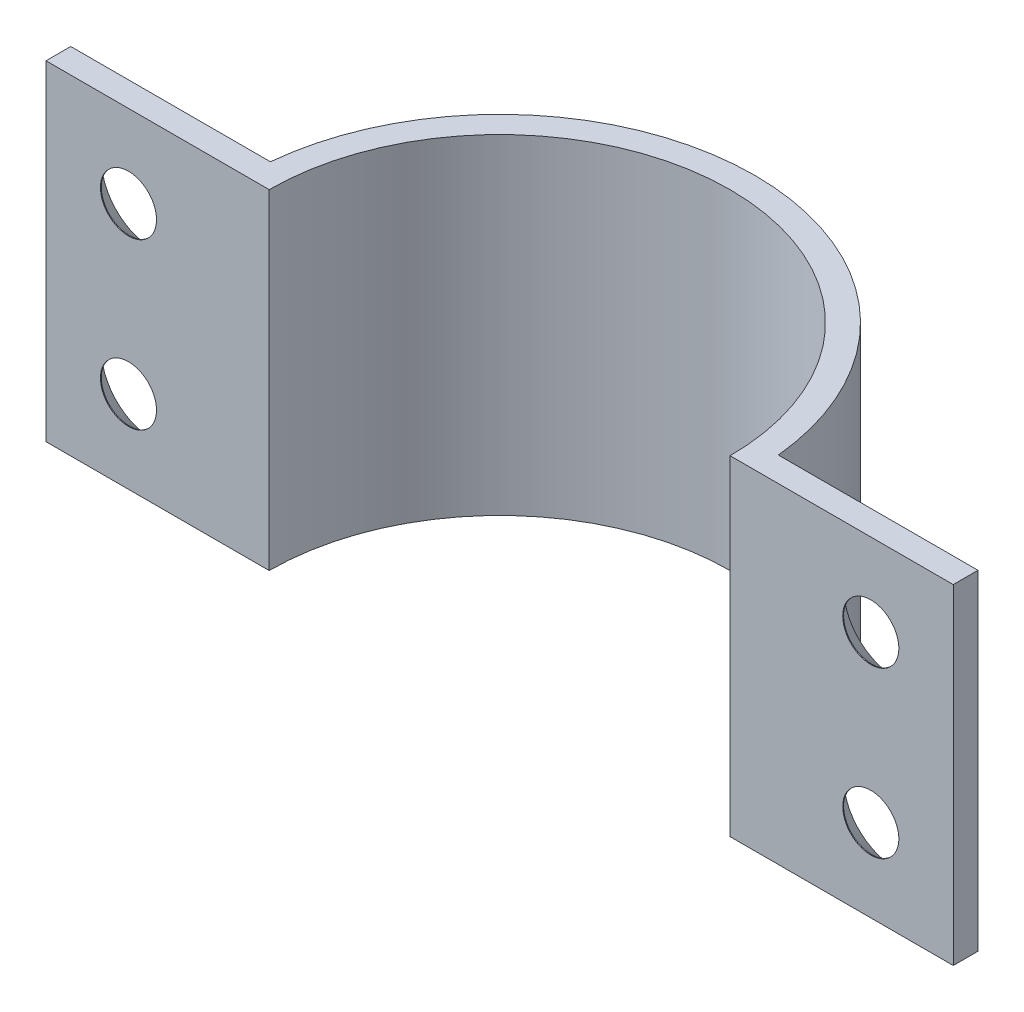
ISO-10303-21;
HEADER;
FILE_DESCRIPTION(('STEP AP214'),'2;1');
FILE_NAME('part.step','',(''),(''),'','','');
FILE_SCHEMA(('AUTOMOTIVE_DESIGN { 1 0 10303 214 1 1 1 1 }'));
ENDSEC;
DATA;
#1=APPLICATION_CONTEXT('core data for automotive mechanical design processes');
#2=APPLICATION_PROTOCOL_DEFINITION('international standard','automotive_design',2000,#1);
#3=PRODUCT_CONTEXT('',#1,'mechanical');
#4=PRODUCT('Part','Part','',(#3));
#5=PRODUCT_RELATED_PRODUCT_CATEGORY('part','',(#4));
#6=PRODUCT_DEFINITION_FORMATION('','',#4);
#7=PRODUCT_DEFINITION_CONTEXT('part definition',#1,'design');
#8=PRODUCT_DEFINITION('design','',#6,#7);
#9=PRODUCT_DEFINITION_SHAPE('','',#8);
#10=(LENGTH_UNIT() NAMED_UNIT(*) SI_UNIT(.MILLI.,.METRE.));
#11=(NAMED_UNIT(*) PLANE_ANGLE_UNIT() SI_UNIT($,.RADIAN.));
#12=(NAMED_UNIT(*) SI_UNIT($,.STERADIAN.) SOLID_ANGLE_UNIT());
#13=UNCERTAINTY_MEASURE_WITH_UNIT(LENGTH_MEASURE(1.E-05),#10,'distance_accuracy_value','');
#14=(GEOMETRIC_REPRESENTATION_CONTEXT(3) GLOBAL_UNCERTAINTY_ASSIGNED_CONTEXT((#13)) GLOBAL_UNIT_ASSIGNED_CONTEXT((#10,
#11,#12)) REPRESENTATION_CONTEXT('',''));
#15=CARTESIAN_POINT('',(0.,0.,0.));
#16=DIRECTION('',(0.,0.,1.));
#17=DIRECTION('',(1.,0.,0.));
#18=AXIS2_PLACEMENT_3D('',#15,#16,#17);
#19=CARTESIAN_POINT('',(0.,20.,0.));
#20=DIRECTION('',(0.,-1.,0.));
#21=DIRECTION('',(0.,0.,-1.));
#22=AXIS2_PLACEMENT_3D('',#19,#20,#21);
#23=CYLINDRICAL_SURFACE('',#22,15.47);
#24=CARTESIAN_POINT('',(0.,0.,0.));
#25=DIRECTION('',(0.,1.,0.));
#26=DIRECTION('',(0.,0.,1.));
#27=AXIS2_PLACEMENT_3D('',#24,#25,#26);
#28=CIRCLE('',#27,15.47);
#29=CARTESIAN_POINT('',(15.3971068710976,0.,-1.5));
#30=VERTEX_POINT('',#29);
#31=CARTESIAN_POINT('',(-15.3971068710976,0.,-1.5));
#32=VERTEX_POINT('',#31);
#33=EDGE_CURVE('E141',#30,#32,#28,.T.);
#34=ORIENTED_EDGE('',*,*,#33,.T.);
#35=DIRECTION('',(0.,-1.,0.));
#36=VECTOR('',#35,1.);
#37=CARTESIAN_POINT('',(-15.3971068710976,20.,-1.5));
#38=LINE('',#37,#36);
#39=CARTESIAN_POINT('',(-15.3971068710976,20.,-1.5));
#40=VERTEX_POINT('',#39);
#41=EDGE_CURVE('E11',#40,#32,#38,.T.);
#42=ORIENTED_EDGE('',*,*,#41,.F.);
#43=CARTESIAN_POINT('',(0.,20.,0.));
#44=DIRECTION('',(0.,1.,0.));
#45=DIRECTION('',(0.,0.,1.));
#46=AXIS2_PLACEMENT_3D('',#43,#44,#45);
#47=CIRCLE('',#46,15.47);
#48=CARTESIAN_POINT('',(15.3971068710976,20.,-1.5));
#49=VERTEX_POINT('',#48);
#50=EDGE_CURVE('E169',#49,#40,#47,.T.);
#51=ORIENTED_EDGE('',*,*,#50,.F.);
#52=DIRECTION('',(0.,-1.,0.));
#53=VECTOR('',#52,1.);
#54=CARTESIAN_POINT('',(15.3971068710976,20.,-1.5));
#55=LINE('',#54,#53);
#56=EDGE_CURVE('E56',#49,#30,#55,.T.);
#57=ORIENTED_EDGE('',*,*,#56,.T.);
#58=EDGE_LOOP('',(#34,#42,#51,#57));
#59=FACE_BOUND('',#58,.T.);
#60=ADVANCED_FACE('F39',(#59),#23,.T.);
#61=CARTESIAN_POINT('',(-15.3971068710976,20.,-1.5));
#62=DIRECTION('',(0.,0.,1.));
#63=DIRECTION('',(1.,0.,0.));
#64=AXIS2_PLACEMENT_3D('',#61,#62,#63);
#65=PLANE('',#64);
#66=CARTESIAN_POINT('',(-22.5,5.,-1.5));
#67=DIRECTION('',(0.,0.,-1.));
#68=DIRECTION('',(-1.,0.,0.));
#69=AXIS2_PLACEMENT_3D('',#66,#67,#68);
#70=CIRCLE('',#69,3.15);
#71=CARTESIAN_POINT('',(-25.65,5.,-1.5));
#72=VERTEX_POINT('',#71);
#73=EDGE_CURVE('E238',#72,#72,#70,.T.);
#74=ORIENTED_EDGE('',*,*,#73,.F.);
#75=EDGE_LOOP('',(#74));
#76=FACE_BOUND('',#75,.T.);
#77=CARTESIAN_POINT('',(-22.5,15.,-1.5));
#78=DIRECTION('',(0.,0.,-1.));
#79=DIRECTION('',(-1.,0.,0.));
#80=AXIS2_PLACEMENT_3D('',#77,#78,#79);
#81=CIRCLE('',#80,3.15);
#82=CARTESIAN_POINT('',(-25.65,15.,-1.5));
#83=VERTEX_POINT('',#82);
#84=EDGE_CURVE('E214',#83,#83,#81,.T.);
#85=ORIENTED_EDGE('',*,*,#84,.F.);
#86=EDGE_LOOP('',(#85));
#87=FACE_BOUND('',#86,.T.);
#88=DIRECTION('',(-1.,0.,0.));
#89=VECTOR('',#88,1.);
#90=CARTESIAN_POINT('',(-15.3971068710976,0.,-1.5));
#91=LINE('',#90,#89);
#92=CARTESIAN_POINT('',(-27.5,0.,-1.5));
#93=VERTEX_POINT('',#92);
#94=EDGE_CURVE('E144',#32,#93,#91,.T.);
#95=ORIENTED_EDGE('',*,*,#94,.T.);
#96=DIRECTION('',(0.,-1.,0.));
#97=VECTOR('',#96,1.);
#98=CARTESIAN_POINT('',(-27.5,20.,-1.5));
#99=LINE('',#98,#97);
#100=CARTESIAN_POINT('',(-27.5,20.,-1.5));
#101=VERTEX_POINT('',#100);
#102=EDGE_CURVE('E48',#101,#93,#99,.T.);
#103=ORIENTED_EDGE('',*,*,#102,.F.);
#104=DIRECTION('',(-1.,0.,0.));
#105=VECTOR('',#104,1.);
#106=CARTESIAN_POINT('',(-15.3971068710976,20.,-1.5));
#107=LINE('',#106,#105);
#108=EDGE_CURVE('E94',#40,#101,#107,.T.);
#109=ORIENTED_EDGE('',*,*,#108,.F.);
#110=ORIENTED_EDGE('',*,*,#41,.T.);
#111=EDGE_LOOP('',(#95,#103,#109,#110));
#112=FACE_BOUND('',#111,.T.);
#113=ADVANCED_FACE('F263',(#76,#87,#112),#65,.F.);
#114=CARTESIAN_POINT('',(-27.5,20.,-1.5));
#115=DIRECTION('',(1.,0.,0.));
#116=DIRECTION('',(0.,0.,-1.));
#117=AXIS2_PLACEMENT_3D('',#114,#115,#116);
#118=PLANE('',#117);
#119=DIRECTION('',(0.,0.,1.));
#120=VECTOR('',#119,1.);
#121=CARTESIAN_POINT('',(-27.5,0.,-1.5));
#122=LINE('',#121,#120);
#123=CARTESIAN_POINT('',(-27.5,0.,0.));
#124=VERTEX_POINT('',#123);
#125=EDGE_CURVE('E148',#93,#124,#122,.T.);
#126=ORIENTED_EDGE('',*,*,#125,.T.);
#127=DIRECTION('',(0.,-1.,0.));
#128=VECTOR('',#127,1.);
#129=CARTESIAN_POINT('',(-27.5,20.,0.));
#130=LINE('',#129,#128);
#131=CARTESIAN_POINT('',(-27.5,20.,0.));
#132=VERTEX_POINT('',#131);
#133=EDGE_CURVE('E179',#132,#124,#130,.T.);
#134=ORIENTED_EDGE('',*,*,#133,.F.);
#135=DIRECTION('',(0.,0.,1.));
#136=VECTOR('',#135,1.);
#137=CARTESIAN_POINT('',(-27.5,20.,-1.5));
#138=LINE('',#137,#136);
#139=EDGE_CURVE('E188',#101,#132,#138,.T.);
#140=ORIENTED_EDGE('',*,*,#139,.F.);
#141=ORIENTED_EDGE('',*,*,#102,.T.);
#142=EDGE_LOOP('',(#126,#134,#140,#141));
#143=FACE_BOUND('',#142,.T.);
#144=ADVANCED_FACE('F186',(#143),#118,.F.);
#145=CARTESIAN_POINT('',(-13.97,20.,0.));
#146=DIRECTION('',(0.,0.,1.));
#147=DIRECTION('',(1.,0.,0.));
#148=AXIS2_PLACEMENT_3D('',#145,#146,#147);
#149=PLANE('',#148);
#150=CARTESIAN_POINT('',(-22.5,5.,0.));
#151=DIRECTION('',(0.,0.,-1.));
#152=DIRECTION('',(-1.,0.,0.));
#153=AXIS2_PLACEMENT_3D('',#150,#151,#152);
#154=CIRCLE('',#153,1.7);
#155=CARTESIAN_POINT('',(-24.2,5.,0.));
#156=VERTEX_POINT('',#155);
#157=EDGE_CURVE('E230',#156,#156,#154,.T.);
#158=ORIENTED_EDGE('',*,*,#157,.T.);
#159=EDGE_LOOP('',(#158));
#160=FACE_BOUND('',#159,.T.);
#161=CARTESIAN_POINT('',(-22.5,15.,0.));
#162=DIRECTION('',(0.,0.,-1.));
#163=DIRECTION('',(-1.,0.,0.));
#164=AXIS2_PLACEMENT_3D('',#161,#162,#163);
#165=CIRCLE('',#164,1.7);
#166=CARTESIAN_POINT('',(-24.2,15.,0.));
#167=VERTEX_POINT('',#166);
#168=EDGE_CURVE('E145',#167,#167,#165,.T.);
#169=ORIENTED_EDGE('',*,*,#168,.T.);
#170=EDGE_LOOP('',(#169));
#171=FACE_BOUND('',#170,.T.);
#172=DIRECTION('',(-1.,0.,0.));
#173=VECTOR('',#172,1.);
#174=CARTESIAN_POINT('',(-13.97,0.,0.));
#175=LINE('',#174,#173);
#176=CARTESIAN_POINT('',(-13.97,0.,0.));
#177=VERTEX_POINT('',#176);
#178=EDGE_CURVE('E152',#177,#124,#175,.T.);
#179=ORIENTED_EDGE('',*,*,#178,.F.);
#180=DIRECTION('',(0.,-1.,0.));
#181=VECTOR('',#180,1.);
#182=CARTESIAN_POINT('',(-13.97,20.,0.));
#183=LINE('',#182,#181);
#184=CARTESIAN_POINT('',(-13.97,20.,0.));
#185=VERTEX_POINT('',#184);
#186=EDGE_CURVE('E176',#185,#177,#183,.T.);
#187=ORIENTED_EDGE('',*,*,#186,.F.);
#188=DIRECTION('',(-1.,0.,0.));
#189=VECTOR('',#188,1.);
#190=CARTESIAN_POINT('',(-13.97,20.,0.));
#191=LINE('',#190,#189);
#192=EDGE_CURVE('E196',#185,#132,#191,.T.);
#193=ORIENTED_EDGE('',*,*,#192,.T.);
#194=ORIENTED_EDGE('',*,*,#133,.T.);
#195=EDGE_LOOP('',(#179,#187,#193,#194));
#196=FACE_BOUND('',#195,.T.);
#197=ADVANCED_FACE('F194',(#160,#171,#196),#149,.T.);
#198=CARTESIAN_POINT('',(0.,20.,0.));
#199=DIRECTION('',(0.,-1.,0.));
#200=DIRECTION('',(0.,0.,-1.));
#201=AXIS2_PLACEMENT_3D('',#198,#199,#200);
#202=CYLINDRICAL_SURFACE('',#201,13.97);
#203=CARTESIAN_POINT('',(0.,0.,0.));
#204=DIRECTION('',(0.,1.,0.));
#205=DIRECTION('',(0.,0.,1.));
#206=AXIS2_PLACEMENT_3D('',#203,#204,#205);
#207=CIRCLE('',#206,13.97);
#208=CARTESIAN_POINT('',(13.97,0.,0.));
#209=VERTEX_POINT('',#208);
#210=EDGE_CURVE('E156',#209,#177,#207,.T.);
#211=ORIENTED_EDGE('',*,*,#210,.F.);
#212=DIRECTION('',(0.,-1.,0.));
#213=VECTOR('',#212,1.);
#214=CARTESIAN_POINT('',(13.97,20.,0.));
#215=LINE('',#214,#213);
#216=CARTESIAN_POINT('',(13.97,20.,0.));
#217=VERTEX_POINT('',#216);
#218=EDGE_CURVE('E131',#217,#209,#215,.T.);
#219=ORIENTED_EDGE('',*,*,#218,.F.);
#220=CARTESIAN_POINT('',(0.,20.,0.));
#221=DIRECTION('',(0.,1.,0.));
#222=DIRECTION('',(0.,0.,1.));
#223=AXIS2_PLACEMENT_3D('',#220,#221,#222);
#224=CIRCLE('',#223,13.97);
#225=EDGE_CURVE('E119',#217,#185,#224,.T.);
#226=ORIENTED_EDGE('',*,*,#225,.T.);
#227=ORIENTED_EDGE('',*,*,#186,.T.);
#228=EDGE_LOOP('',(#211,#219,#226,#227));
#229=FACE_BOUND('',#228,.T.);
#230=ADVANCED_FACE('F276',(#229),#202,.F.);
#231=CARTESIAN_POINT('',(13.97,20.,0.));
#232=DIRECTION('',(0.,0.,-1.));
#233=DIRECTION('',(-1.,0.,0.));
#234=AXIS2_PLACEMENT_3D('',#231,#232,#233);
#235=PLANE('',#234);
#236=CARTESIAN_POINT('',(22.5,5.,0.));
#237=DIRECTION('',(0.,0.,-1.));
#238=DIRECTION('',(-1.,0.,0.));
#239=AXIS2_PLACEMENT_3D('',#236,#237,#238);
#240=CIRCLE('',#239,1.7);
#241=CARTESIAN_POINT('',(20.8,5.,0.));
#242=VERTEX_POINT('',#241);
#243=EDGE_CURVE('E242',#242,#242,#240,.T.);
#244=ORIENTED_EDGE('',*,*,#243,.T.);
#245=EDGE_LOOP('',(#244));
#246=FACE_BOUND('',#245,.T.);
#247=CARTESIAN_POINT('',(22.5,15.,0.));
#248=DIRECTION('',(0.,0.,-1.));
#249=DIRECTION('',(-1.,0.,0.));
#250=AXIS2_PLACEMENT_3D('',#247,#248,#249);
#251=CIRCLE('',#250,1.7);
#252=CARTESIAN_POINT('',(20.8,15.,0.));
#253=VERTEX_POINT('',#252);
#254=EDGE_CURVE('E218',#253,#253,#251,.T.);
#255=ORIENTED_EDGE('',*,*,#254,.T.);
#256=EDGE_LOOP('',(#255));
#257=FACE_BOUND('',#256,.T.);
#258=DIRECTION('',(1.,0.,0.));
#259=VECTOR('',#258,1.);
#260=CARTESIAN_POINT('',(13.97,0.,0.));
#261=LINE('',#260,#259);
#262=CARTESIAN_POINT('',(27.5,0.,0.));
#263=VERTEX_POINT('',#262);
#264=EDGE_CURVE('E127',#209,#263,#261,.T.);
#265=ORIENTED_EDGE('',*,*,#264,.T.);
#266=DIRECTION('',(0.,-1.,0.));
#267=VECTOR('',#266,1.);
#268=CARTESIAN_POINT('',(27.5,20.,0.));
#269=LINE('',#268,#267);
#270=CARTESIAN_POINT('',(27.5,20.,0.));
#271=VERTEX_POINT('',#270);
#272=EDGE_CURVE('E124',#271,#263,#269,.T.);
#273=ORIENTED_EDGE('',*,*,#272,.F.);
#274=DIRECTION('',(1.,0.,0.));
#275=VECTOR('',#274,1.);
#276=CARTESIAN_POINT('',(13.97,20.,0.));
#277=LINE('',#276,#275);
#278=EDGE_CURVE('E111',#217,#271,#277,.T.);
#279=ORIENTED_EDGE('',*,*,#278,.F.);
#280=ORIENTED_EDGE('',*,*,#218,.T.);
#281=EDGE_LOOP('',(#265,#273,#279,#280));
#282=FACE_BOUND('',#281,.T.);
#283=ADVANCED_FACE('F125',(#246,#257,#282),#235,.F.);
#284=CARTESIAN_POINT('',(27.5,20.,-1.5));
#285=DIRECTION('',(1.,0.,0.));
#286=DIRECTION('',(0.,0.,-1.));
#287=AXIS2_PLACEMENT_3D('',#284,#285,#286);
#288=PLANE('',#287);
#289=DIRECTION('',(0.,0.,1.));
#290=VECTOR('',#289,1.);
#291=CARTESIAN_POINT('',(27.5,0.,-1.5));
#292=LINE('',#291,#290);
#293=CARTESIAN_POINT('',(27.5,0.,-1.5));
#294=VERTEX_POINT('',#293);
#295=EDGE_CURVE('E162',#294,#263,#292,.T.);
#296=ORIENTED_EDGE('',*,*,#295,.F.);
#297=DIRECTION('',(0.,-1.,0.));
#298=VECTOR('',#297,1.);
#299=CARTESIAN_POINT('',(27.5,20.,-1.5));
#300=LINE('',#299,#298);
#301=CARTESIAN_POINT('',(27.5,20.,-1.5));
#302=VERTEX_POINT('',#301);
#303=EDGE_CURVE('E82',#302,#294,#300,.T.);
#304=ORIENTED_EDGE('',*,*,#303,.F.);
#305=DIRECTION('',(0.,0.,1.));
#306=VECTOR('',#305,1.);
#307=CARTESIAN_POINT('',(27.5,20.,-1.5));
#308=LINE('',#307,#306);
#309=EDGE_CURVE('E116',#302,#271,#308,.T.);
#310=ORIENTED_EDGE('',*,*,#309,.T.);
#311=ORIENTED_EDGE('',*,*,#272,.T.);
#312=EDGE_LOOP('',(#296,#304,#310,#311));
#313=FACE_BOUND('',#312,.T.);
#314=ADVANCED_FACE('F133',(#313),#288,.T.);
#315=CARTESIAN_POINT('',(15.3971068710976,20.,-1.5));
#316=DIRECTION('',(0.,0.,-1.));
#317=DIRECTION('',(-1.,0.,0.));
#318=AXIS2_PLACEMENT_3D('',#315,#316,#317);
#319=PLANE('',#318);
#320=CARTESIAN_POINT('',(22.5,5.,-1.5));
#321=DIRECTION('',(0.,0.,-1.));
#322=DIRECTION('',(-1.,0.,0.));
#323=AXIS2_PLACEMENT_3D('',#320,#321,#322);
#324=CIRCLE('',#323,3.15);
#325=CARTESIAN_POINT('',(19.35,5.,-1.5));
#326=VERTEX_POINT('',#325);
#327=EDGE_CURVE('E250',#326,#326,#324,.T.);
#328=ORIENTED_EDGE('',*,*,#327,.F.);
#329=EDGE_LOOP('',(#328));
#330=FACE_BOUND('',#329,.T.);
#331=CARTESIAN_POINT('',(22.5,15.,-1.5));
#332=DIRECTION('',(0.,0.,-1.));
#333=DIRECTION('',(-1.,0.,0.));
#334=AXIS2_PLACEMENT_3D('',#331,#332,#333);
#335=CIRCLE('',#334,3.15);
#336=CARTESIAN_POINT('',(19.35,15.,-1.5));
#337=VERTEX_POINT('',#336);
#338=EDGE_CURVE('E226',#337,#337,#335,.T.);
#339=ORIENTED_EDGE('',*,*,#338,.F.);
#340=EDGE_LOOP('',(#339));
#341=FACE_BOUND('',#340,.T.);
#342=DIRECTION('',(1.,0.,0.));
#343=VECTOR('',#342,1.);
#344=CARTESIAN_POINT('',(15.3971068710976,0.,-1.5));
#345=LINE('',#344,#343);
#346=EDGE_CURVE('E165',#30,#294,#345,.T.);
#347=ORIENTED_EDGE('',*,*,#346,.F.);
#348=ORIENTED_EDGE('',*,*,#56,.F.);
#349=DIRECTION('',(1.,0.,0.));
#350=VECTOR('',#349,1.);
#351=CARTESIAN_POINT('',(15.3971068710976,20.,-1.5));
#352=LINE('',#351,#350);
#353=EDGE_CURVE('E135',#49,#302,#352,.T.);
#354=ORIENTED_EDGE('',*,*,#353,.T.);
#355=ORIENTED_EDGE('',*,*,#303,.T.);
#356=EDGE_LOOP('',(#347,#348,#354,#355));
#357=FACE_BOUND('',#356,.T.);
#358=ADVANCED_FACE('F257',(#330,#341,#357),#319,.T.);
#359=CARTESIAN_POINT('',(0.,20.,0.));
#360=DIRECTION('',(0.,1.,0.));
#361=DIRECTION('',(0.,0.,1.));
#362=AXIS2_PLACEMENT_3D('',#359,#360,#361);
#363=PLANE('',#362);
#364=ORIENTED_EDGE('',*,*,#50,.T.);
#365=ORIENTED_EDGE('',*,*,#108,.T.);
#366=ORIENTED_EDGE('',*,*,#139,.T.);
#367=ORIENTED_EDGE('',*,*,#192,.F.);
#368=ORIENTED_EDGE('',*,*,#225,.F.);
#369=ORIENTED_EDGE('',*,*,#278,.T.);
#370=ORIENTED_EDGE('',*,*,#309,.F.);
#371=ORIENTED_EDGE('',*,*,#353,.F.);
#372=EDGE_LOOP('',(#364,#365,#366,#367,#368,#369,#370,#371));
#373=FACE_BOUND('',#372,.T.);
#374=ADVANCED_FACE('F113',(#373),#363,.T.);
#375=CARTESIAN_POINT('',(0.,0.,0.));
#376=DIRECTION('',(0.,1.,0.));
#377=DIRECTION('',(0.,0.,1.));
#378=AXIS2_PLACEMENT_3D('',#375,#376,#377);
#379=PLANE('',#378);
#380=ORIENTED_EDGE('',*,*,#33,.F.);
#381=ORIENTED_EDGE('',*,*,#346,.T.);
#382=ORIENTED_EDGE('',*,*,#295,.T.);
#383=ORIENTED_EDGE('',*,*,#264,.F.);
#384=ORIENTED_EDGE('',*,*,#210,.T.);
#385=ORIENTED_EDGE('',*,*,#178,.T.);
#386=ORIENTED_EDGE('',*,*,#125,.F.);
#387=ORIENTED_EDGE('',*,*,#94,.F.);
#388=EDGE_LOOP('',(#380,#381,#382,#383,#384,#385,#386,#387));
#389=FACE_BOUND('',#388,.T.);
#390=ADVANCED_FACE('F190',(#389),#379,.F.);
#391=CARTESIAN_POINT('',(-22.5,15.,-1.5));
#392=DIRECTION('',(0.,0.,-1.));
#393=DIRECTION('',(-1.,0.,0.));
#394=AXIS2_PLACEMENT_3D('',#391,#392,#393);
#395=CYLINDRICAL_SURFACE('',#394,1.69999999999999);
#396=ORIENTED_EDGE('',*,*,#168,.F.);
#397=EDGE_LOOP('',(#396));
#398=FACE_BOUND('',#397,.T.);
#399=CARTESIAN_POINT('',(-22.5,15.,-0.0499999999999932));
#400=DIRECTION('',(0.,0.,-1.));
#401=DIRECTION('',(-1.,0.,0.));
#402=AXIS2_PLACEMENT_3D('',#399,#400,#401);
#403=CIRCLE('',#402,1.69999999999999);
#404=CARTESIAN_POINT('',(-24.2,15.,-0.0499999999999932));
#405=VERTEX_POINT('',#404);
#406=EDGE_CURVE('E210',#405,#405,#403,.T.);
#407=ORIENTED_EDGE('',*,*,#406,.T.);
#408=EDGE_LOOP('',(#407));
#409=FACE_BOUND('',#408,.T.);
#410=ADVANCED_FACE('F288',(#398,#409),#395,.F.);
#411=CARTESIAN_POINT('',(-22.5,15.,-1.5));
#412=DIRECTION('',(0.,0.,-1.));
#413=DIRECTION('',(-1.,0.,0.));
#414=AXIS2_PLACEMENT_3D('',#411,#412,#413);
#415=CONICAL_SURFACE('',#414,3.15,0.78539816339745);
#416=ORIENTED_EDGE('',*,*,#406,.F.);
#417=EDGE_LOOP('',(#416));
#418=FACE_BOUND('',#417,.T.);
#419=ORIENTED_EDGE('',*,*,#84,.T.);
#420=EDGE_LOOP('',(#419));
#421=FACE_BOUND('',#420,.T.);
#422=ADVANCED_FACE('F293',(#418,#421),#415,.F.);
#423=CARTESIAN_POINT('',(22.5,15.,-1.5));
#424=DIRECTION('',(0.,0.,-1.));
#425=DIRECTION('',(-1.,0.,0.));
#426=AXIS2_PLACEMENT_3D('',#423,#424,#425);
#427=CYLINDRICAL_SURFACE('',#426,1.69999999999999);
#428=ORIENTED_EDGE('',*,*,#254,.F.);
#429=EDGE_LOOP('',(#428));
#430=FACE_BOUND('',#429,.T.);
#431=CARTESIAN_POINT('',(22.5,15.,-0.0499999999999932));
#432=DIRECTION('',(0.,0.,-1.));
#433=DIRECTION('',(-1.,0.,0.));
#434=AXIS2_PLACEMENT_3D('',#431,#432,#433);
#435=CIRCLE('',#434,1.69999999999999);
#436=CARTESIAN_POINT('',(20.8,15.,-0.0499999999999932));
#437=VERTEX_POINT('',#436);
#438=EDGE_CURVE('E222',#437,#437,#435,.T.);
#439=ORIENTED_EDGE('',*,*,#438,.T.);
#440=EDGE_LOOP('',(#439));
#441=FACE_BOUND('',#440,.T.);
#442=ADVANCED_FACE('F297',(#430,#441),#427,.F.);
#443=CARTESIAN_POINT('',(22.5,15.,-1.5));
#444=DIRECTION('',(0.,0.,-1.));
#445=DIRECTION('',(-1.,0.,0.));
#446=AXIS2_PLACEMENT_3D('',#443,#444,#445);
#447=CONICAL_SURFACE('',#446,3.15,0.78539816339745);
#448=ORIENTED_EDGE('',*,*,#438,.F.);
#449=EDGE_LOOP('',(#448));
#450=FACE_BOUND('',#449,.T.);
#451=ORIENTED_EDGE('',*,*,#338,.T.);
#452=EDGE_LOOP('',(#451));
#453=FACE_BOUND('',#452,.T.);
#454=ADVANCED_FACE('F301',(#450,#453),#447,.F.);
#455=CARTESIAN_POINT('',(-22.5,5.,-1.5));
#456=DIRECTION('',(0.,0.,-1.));
#457=DIRECTION('',(-1.,0.,0.));
#458=AXIS2_PLACEMENT_3D('',#455,#456,#457);
#459=CYLINDRICAL_SURFACE('',#458,1.69999999999999);
#460=ORIENTED_EDGE('',*,*,#157,.F.);
#461=EDGE_LOOP('',(#460));
#462=FACE_BOUND('',#461,.T.);
#463=CARTESIAN_POINT('',(-22.5,5.,-0.0499999999999932));
#464=DIRECTION('',(0.,0.,-1.));
#465=DIRECTION('',(-1.,0.,0.));
#466=AXIS2_PLACEMENT_3D('',#463,#464,#465);
#467=CIRCLE('',#466,1.69999999999999);
#468=CARTESIAN_POINT('',(-24.2,5.,-0.0499999999999932));
#469=VERTEX_POINT('',#468);
#470=EDGE_CURVE('E234',#469,#469,#467,.T.);
#471=ORIENTED_EDGE('',*,*,#470,.T.);
#472=EDGE_LOOP('',(#471));
#473=FACE_BOUND('',#472,.T.);
#474=ADVANCED_FACE('F305',(#462,#473),#459,.F.);
#475=CARTESIAN_POINT('',(-22.5,5.,-1.5));
#476=DIRECTION('',(0.,0.,-1.));
#477=DIRECTION('',(-1.,0.,0.));
#478=AXIS2_PLACEMENT_3D('',#475,#476,#477);
#479=CONICAL_SURFACE('',#478,3.15,0.78539816339745);
#480=ORIENTED_EDGE('',*,*,#470,.F.);
#481=EDGE_LOOP('',(#480));
#482=FACE_BOUND('',#481,.T.);
#483=ORIENTED_EDGE('',*,*,#73,.T.);
#484=EDGE_LOOP('',(#483));
#485=FACE_BOUND('',#484,.T.);
#486=ADVANCED_FACE('F309',(#482,#485),#479,.F.);
#487=CARTESIAN_POINT('',(22.5,5.,-1.5));
#488=DIRECTION('',(0.,0.,-1.));
#489=DIRECTION('',(-1.,0.,0.));
#490=AXIS2_PLACEMENT_3D('',#487,#488,#489);
#491=CYLINDRICAL_SURFACE('',#490,1.69999999999999);
#492=ORIENTED_EDGE('',*,*,#243,.F.);
#493=EDGE_LOOP('',(#492));
#494=FACE_BOUND('',#493,.T.);
#495=CARTESIAN_POINT('',(22.5,5.,-0.0499999999999932));
#496=DIRECTION('',(0.,0.,-1.));
#497=DIRECTION('',(-1.,0.,0.));
#498=AXIS2_PLACEMENT_3D('',#495,#496,#497);
#499=CIRCLE('',#498,1.69999999999999);
#500=CARTESIAN_POINT('',(20.8,5.,-0.0499999999999932));
#501=VERTEX_POINT('',#500);
#502=EDGE_CURVE('E246',#501,#501,#499,.T.);
#503=ORIENTED_EDGE('',*,*,#502,.T.);
#504=EDGE_LOOP('',(#503));
#505=FACE_BOUND('',#504,.T.);
#506=ADVANCED_FACE('F313',(#494,#505),#491,.F.);
#507=CARTESIAN_POINT('',(22.5,5.,-1.5));
#508=DIRECTION('',(0.,0.,-1.));
#509=DIRECTION('',(-1.,0.,0.));
#510=AXIS2_PLACEMENT_3D('',#507,#508,#509);
#511=CONICAL_SURFACE('',#510,3.15,0.78539816339745);
#512=ORIENTED_EDGE('',*,*,#502,.F.);
#513=EDGE_LOOP('',(#512));
#514=FACE_BOUND('',#513,.T.);
#515=ORIENTED_EDGE('',*,*,#327,.T.);
#516=EDGE_LOOP('',(#515));
#517=FACE_BOUND('',#516,.T.);
#518=ADVANCED_FACE('F255',(#514,#517),#511,.F.);
#519=CLOSED_SHELL('',(#60,#113,#144,#197,#230,#283,#314,#358,#374,#390,#410,#422,#442,#454,#474,
#486,#506,#518));
#520=MANIFOLD_SOLID_BREP('B2',#519);
#521=ADVANCED_BREP_SHAPE_REPRESENTATION('',(#18,#520),#14);
#522=SHAPE_DEFINITION_REPRESENTATION(#9,#521);
ENDSEC;
END-ISO-10303-21;
